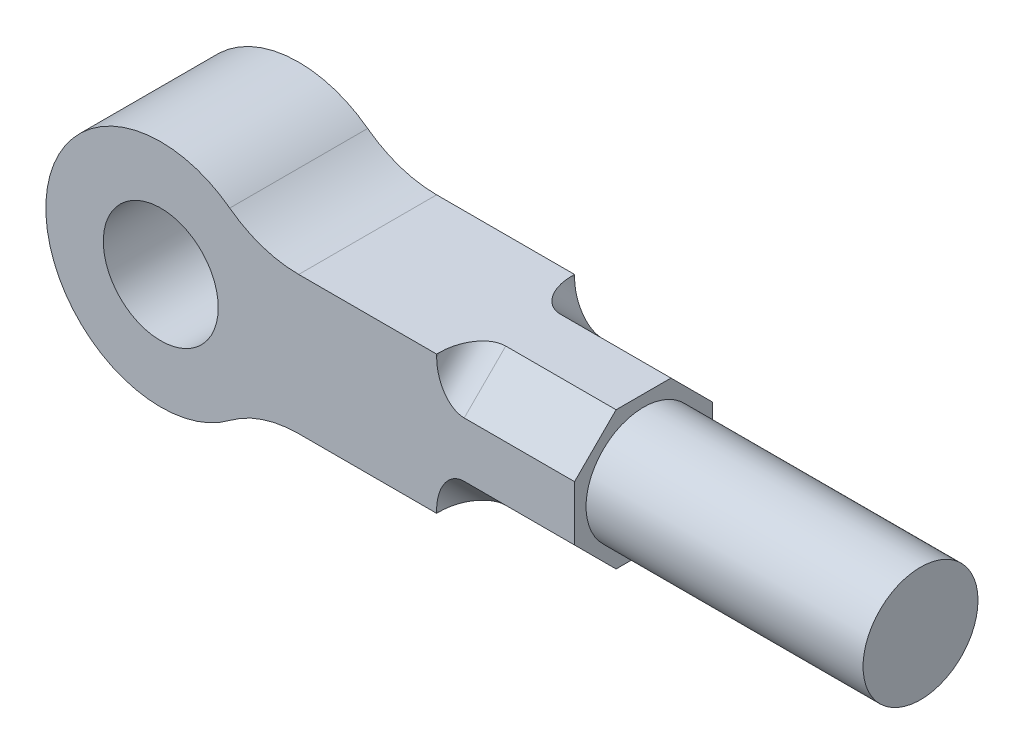
ISO-10303-21;
HEADER;
FILE_DESCRIPTION(('STEP AP214'),'2;1');
FILE_NAME('part.step','',(''),(''),'','','');
FILE_SCHEMA(('AUTOMOTIVE_DESIGN { 1 0 10303 214 1 1 1 1 }'));
ENDSEC;
DATA;
#1=APPLICATION_CONTEXT('core data for automotive mechanical design processes');
#2=APPLICATION_PROTOCOL_DEFINITION('international standard','automotive_design',2000,#1);
#3=PRODUCT_CONTEXT('',#1,'mechanical');
#4=PRODUCT('Part','Part','',(#3));
#5=PRODUCT_RELATED_PRODUCT_CATEGORY('part','',(#4));
#6=PRODUCT_DEFINITION_FORMATION('','',#4);
#7=PRODUCT_DEFINITION_CONTEXT('part definition',#1,'design');
#8=PRODUCT_DEFINITION('design','',#6,#7);
#9=PRODUCT_DEFINITION_SHAPE('','',#8);
#10=(LENGTH_UNIT() NAMED_UNIT(*) SI_UNIT(.MILLI.,.METRE.));
#11=(NAMED_UNIT(*) PLANE_ANGLE_UNIT() SI_UNIT($,.RADIAN.));
#12=(NAMED_UNIT(*) SI_UNIT($,.STERADIAN.) SOLID_ANGLE_UNIT());
#13=UNCERTAINTY_MEASURE_WITH_UNIT(LENGTH_MEASURE(1.E-05),#10,'distance_accuracy_value','');
#14=(GEOMETRIC_REPRESENTATION_CONTEXT(3) GLOBAL_UNCERTAINTY_ASSIGNED_CONTEXT((#13)) GLOBAL_UNIT_ASSIGNED_CONTEXT((#10,
#11,#12)) REPRESENTATION_CONTEXT('',''));
#15=CARTESIAN_POINT('',(0.,0.,0.));
#16=DIRECTION('',(0.,0.,1.));
#17=DIRECTION('',(1.,0.,0.));
#18=AXIS2_PLACEMENT_3D('',#15,#16,#17);
#19=CARTESIAN_POINT('',(0.,0.,60.));
#20=DIRECTION('',(0.,0.,1.));
#21=DIRECTION('',(1.,0.,0.));
#22=AXIS2_PLACEMENT_3D('',#19,#20,#21);
#23=PLANE('',#22);
#24=CARTESIAN_POINT('',(0.,0.,60.));
#25=DIRECTION('',(0.,0.,1.));
#26=DIRECTION('',(1.,0.,0.));
#27=AXIS2_PLACEMENT_3D('',#24,#25,#26);
#28=CIRCLE('',#27,25.);
#29=CARTESIAN_POINT('',(25.,0.,60.));
#30=VERTEX_POINT('',#29);
#31=EDGE_CURVE('E310',#30,#30,#28,.T.);
#32=ORIENTED_EDGE('',*,*,#31,.F.);
#33=EDGE_LOOP('',(#32));
#34=FACE_BOUND('',#33,.T.);
#35=DIRECTION('',(0.,1.,0.));
#36=VECTOR('',#35,1.);
#37=CARTESIAN_POINT('',(120.,-30.0000000000006,59.9999999999999));
#38=LINE('',#37,#36);
#39=CARTESIAN_POINT('',(120.,-30.0000000000006,59.9999999999999));
#40=VERTEX_POINT('',#39);
#41=CARTESIAN_POINT('',(120.,-28.9105627484778,59.9999999999999));
#42=VERTEX_POINT('',#41);
#43=EDGE_CURVE('E297',#40,#42,#38,.T.);
#44=ORIENTED_EDGE('',*,*,#43,.T.);
#45=CARTESIAN_POINT('',(132.,-28.9105627484776,60.));
#46=DIRECTION('',(0.,0.,1.));
#47=DIRECTION('',(0.,1.,0.));
#48=AXIS2_PLACEMENT_3D('',#45,#46,#47);
#49=ELLIPSE('',#48,16.9705627484773,12.);
#50=CARTESIAN_POINT('',(132.,-11.9400000000006,59.9999999999998));
#51=VERTEX_POINT('',#50);
#52=EDGE_CURVE('E252',#42,#51,#49,.F.);
#53=ORIENTED_EDGE('',*,*,#52,.T.);
#54=DIRECTION('',(1.,0.,0.));
#55=VECTOR('',#54,1.);
#56=CARTESIAN_POINT('',(120.,-11.9400000000006,59.9999999999998));
#57=LINE('',#56,#55);
#58=CARTESIAN_POINT('',(180.,-11.9400000000006,59.9999999999998));
#59=VERTEX_POINT('',#58);
#60=EDGE_CURVE('E290',#51,#59,#57,.T.);
#61=ORIENTED_EDGE('',*,*,#60,.T.);
#62=DIRECTION('',(0.,1.,0.));
#63=VECTOR('',#62,1.);
#64=CARTESIAN_POINT('',(180.,30.,60.));
#65=LINE('',#64,#63);
#66=CARTESIAN_POINT('',(180.,11.9399999999997,60.0000000000001));
#67=VERTEX_POINT('',#66);
#68=EDGE_CURVE('E207',#59,#67,#65,.T.);
#69=ORIENTED_EDGE('',*,*,#68,.T.);
#70=DIRECTION('',(1.,0.,0.));
#71=VECTOR('',#70,1.);
#72=CARTESIAN_POINT('',(120.,11.9399999999997,60.0000000000001));
#73=LINE('',#72,#71);
#74=CARTESIAN_POINT('',(132.,11.9399999999997,60.0000000000001));
#75=VERTEX_POINT('',#74);
#76=EDGE_CURVE('E305',#75,#67,#73,.T.);
#77=ORIENTED_EDGE('',*,*,#76,.F.);
#78=CARTESIAN_POINT('',(132.,28.9105627484768,60.));
#79=DIRECTION('',(0.,0.,1.));
#80=DIRECTION('',(0.,1.,0.));
#81=AXIS2_PLACEMENT_3D('',#78,#79,#80);
#82=ELLIPSE('',#81,16.970562748477,12.);
#83=CARTESIAN_POINT('',(120.,28.9105627484769,60.));
#84=VERTEX_POINT('',#83);
#85=EDGE_CURVE('E55',#75,#84,#82,.F.);
#86=ORIENTED_EDGE('',*,*,#85,.T.);
#87=DIRECTION('',(0.,1.,0.));
#88=VECTOR('',#87,1.);
#89=CARTESIAN_POINT('',(120.,11.9399999999997,60.0000000000001));
#90=LINE('',#89,#88);
#91=CARTESIAN_POINT('',(120.,29.9999999999997,59.9999999999999));
#92=VERTEX_POINT('',#91);
#93=EDGE_CURVE('E303',#84,#92,#90,.T.);
#94=ORIENTED_EDGE('',*,*,#93,.T.);
#95=DIRECTION('',(-1.,0.,0.));
#96=VECTOR('',#95,1.);
#97=CARTESIAN_POINT('',(40.,30.,60.));
#98=LINE('',#97,#96);
#99=CARTESIAN_POINT('',(60.,30.,60.));
#100=VERTEX_POINT('',#99);
#101=EDGE_CURVE('E202',#92,#100,#98,.T.);
#102=ORIENTED_EDGE('',*,*,#101,.T.);
#103=CARTESIAN_POINT('',(60.,80.,60.));
#104=DIRECTION('',(0.,0.,1.));
#105=DIRECTION('',(1.,0.,0.));
#106=AXIS2_PLACEMENT_3D('',#103,#104,#105);
#107=CIRCLE('',#106,50.);
#108=CARTESIAN_POINT('',(30.,40.,60.));
#109=VERTEX_POINT('',#108);
#110=EDGE_CURVE('E230',#100,#109,#107,.F.);
#111=ORIENTED_EDGE('',*,*,#110,.T.);
#112=CARTESIAN_POINT('',(0.,0.,60.));
#113=DIRECTION('',(0.,0.,1.));
#114=DIRECTION('',(1.,0.,0.));
#115=AXIS2_PLACEMENT_3D('',#112,#113,#114);
#116=CIRCLE('',#115,50.);
#117=CARTESIAN_POINT('',(30.,-40.,60.));
#118=VERTEX_POINT('',#117);
#119=EDGE_CURVE('E316',#109,#118,#116,.T.);
#120=ORIENTED_EDGE('',*,*,#119,.T.);
#121=CARTESIAN_POINT('',(60.,-80.,60.));
#122=DIRECTION('',(0.,0.,1.));
#123=DIRECTION('',(1.,0.,0.));
#124=AXIS2_PLACEMENT_3D('',#121,#122,#123);
#125=CIRCLE('',#124,50.);
#126=CARTESIAN_POINT('',(60.,-30.,60.));
#127=VERTEX_POINT('',#126);
#128=EDGE_CURVE('E225',#118,#127,#125,.F.);
#129=ORIENTED_EDGE('',*,*,#128,.T.);
#130=DIRECTION('',(1.,0.,0.));
#131=VECTOR('',#130,1.);
#132=CARTESIAN_POINT('',(40.,-30.,60.));
#133=LINE('',#132,#131);
#134=EDGE_CURVE('E319',#127,#40,#133,.T.);
#135=ORIENTED_EDGE('',*,*,#134,.T.);
#136=EDGE_LOOP('',(#44,#53,#61,#69,#77,#86,#94,#102,#111,#120,#129,#135));
#137=FACE_BOUND('',#136,.T.);
#138=ADVANCED_FACE('F47',(#34,#137),#23,.T.);
#139=CARTESIAN_POINT('',(0.,0.,0.));
#140=DIRECTION('',(0.,0.,1.));
#141=DIRECTION('',(1.,0.,0.));
#142=AXIS2_PLACEMENT_3D('',#139,#140,#141);
#143=PLANE('',#142);
#144=CARTESIAN_POINT('',(0.,0.,0.));
#145=DIRECTION('',(0.,0.,1.));
#146=DIRECTION('',(1.,0.,0.));
#147=AXIS2_PLACEMENT_3D('',#144,#145,#146);
#148=CIRCLE('',#147,25.);
#149=CARTESIAN_POINT('',(25.,0.,0.));
#150=VERTEX_POINT('',#149);
#151=EDGE_CURVE('E309',#150,#150,#148,.T.);
#152=ORIENTED_EDGE('',*,*,#151,.T.);
#153=EDGE_LOOP('',(#152));
#154=FACE_BOUND('',#153,.T.);
#155=DIRECTION('',(1.,0.,0.));
#156=VECTOR('',#155,1.);
#157=CARTESIAN_POINT('',(120.,-11.9400000000004,-5.3776427755281E-13));
#158=LINE('',#157,#156);
#159=CARTESIAN_POINT('',(132.,-11.9400000000004,-5.3776427755281E-13));
#160=VERTEX_POINT('',#159);
#161=CARTESIAN_POINT('',(180.,-11.9400000000004,0.));
#162=VERTEX_POINT('',#161);
#163=EDGE_CURVE('E281',#160,#162,#158,.T.);
#164=ORIENTED_EDGE('',*,*,#163,.F.);
#165=CARTESIAN_POINT('',(132.,-28.910562748478,0.));
#166=DIRECTION('',(0.,0.,1.));
#167=DIRECTION('',(0.,-1.,0.));
#168=AXIS2_PLACEMENT_3D('',#165,#166,#167);
#169=ELLIPSE('',#168,16.9705627484771,12.);
#170=CARTESIAN_POINT('',(120.,-28.9105627484775,-4.79081419877752E-13));
#171=VERTEX_POINT('',#170);
#172=EDGE_CURVE('E254',#160,#171,#169,.T.);
#173=ORIENTED_EDGE('',*,*,#172,.T.);
#174=DIRECTION('',(0.,-1.,0.));
#175=VECTOR('',#174,1.);
#176=CARTESIAN_POINT('',(120.,-11.9400000000004,-5.3776427755281E-13));
#177=LINE('',#176,#175);
#178=CARTESIAN_POINT('',(120.,-30.0000000000004,-4.75314232417645E-13));
#179=VERTEX_POINT('',#178);
#180=EDGE_CURVE('E284',#171,#179,#177,.T.);
#181=ORIENTED_EDGE('',*,*,#180,.T.);
#182=DIRECTION('',(1.,0.,0.));
#183=VECTOR('',#182,1.);
#184=CARTESIAN_POINT('',(40.,-30.,0.));
#185=LINE('',#184,#183);
#186=CARTESIAN_POINT('',(60.,-30.,0.));
#187=VERTEX_POINT('',#186);
#188=EDGE_CURVE('E326',#187,#179,#185,.T.);
#189=ORIENTED_EDGE('',*,*,#188,.F.);
#190=CARTESIAN_POINT('',(60.,-80.,0.));
#191=DIRECTION('',(0.,0.,1.));
#192=DIRECTION('',(1.,0.,0.));
#193=AXIS2_PLACEMENT_3D('',#190,#191,#192);
#194=CIRCLE('',#193,50.);
#195=CARTESIAN_POINT('',(30.,-40.,0.));
#196=VERTEX_POINT('',#195);
#197=EDGE_CURVE('E223',#187,#196,#194,.T.);
#198=ORIENTED_EDGE('',*,*,#197,.T.);
#199=CARTESIAN_POINT('',(0.,0.,0.));
#200=DIRECTION('',(0.,0.,1.));
#201=DIRECTION('',(1.,0.,0.));
#202=AXIS2_PLACEMENT_3D('',#199,#200,#201);
#203=CIRCLE('',#202,50.);
#204=CARTESIAN_POINT('',(30.,40.,0.));
#205=VERTEX_POINT('',#204);
#206=EDGE_CURVE('E313',#205,#196,#203,.T.);
#207=ORIENTED_EDGE('',*,*,#206,.F.);
#208=CARTESIAN_POINT('',(60.,80.,0.));
#209=DIRECTION('',(0.,0.,1.));
#210=DIRECTION('',(1.,0.,0.));
#211=AXIS2_PLACEMENT_3D('',#208,#209,#210);
#212=CIRCLE('',#211,50.);
#213=CARTESIAN_POINT('',(60.,30.,0.));
#214=VERTEX_POINT('',#213);
#215=EDGE_CURVE('E227',#205,#214,#212,.T.);
#216=ORIENTED_EDGE('',*,*,#215,.T.);
#217=DIRECTION('',(-1.,0.,0.));
#218=VECTOR('',#217,1.);
#219=CARTESIAN_POINT('',(40.,30.,0.));
#220=LINE('',#219,#218);
#221=CARTESIAN_POINT('',(120.,30.,0.));
#222=VERTEX_POINT('',#221);
#223=EDGE_CURVE('E210',#222,#214,#220,.T.);
#224=ORIENTED_EDGE('',*,*,#223,.F.);
#225=DIRECTION('',(0.,-1.,0.));
#226=VECTOR('',#225,1.);
#227=CARTESIAN_POINT('',(120.,30.,0.));
#228=LINE('',#227,#226);
#229=CARTESIAN_POINT('',(120.,28.9105627484771,0.));
#230=VERTEX_POINT('',#229);
#231=EDGE_CURVE('E182',#222,#230,#228,.T.);
#232=ORIENTED_EDGE('',*,*,#231,.T.);
#233=CARTESIAN_POINT('',(132.,28.9105627484771,0.));
#234=DIRECTION('',(0.,0.,1.));
#235=DIRECTION('',(0.,1.,0.));
#236=AXIS2_PLACEMENT_3D('',#233,#234,#235);
#237=ELLIPSE('',#236,16.9705627484771,12.);
#238=CARTESIAN_POINT('',(132.,11.94,0.));
#239=VERTEX_POINT('',#238);
#240=EDGE_CURVE('E260',#230,#239,#237,.T.);
#241=ORIENTED_EDGE('',*,*,#240,.T.);
#242=DIRECTION('',(1.,0.,0.));
#243=VECTOR('',#242,1.);
#244=CARTESIAN_POINT('',(120.,11.94,0.));
#245=LINE('',#244,#243);
#246=CARTESIAN_POINT('',(180.,11.94,0.));
#247=VERTEX_POINT('',#246);
#248=EDGE_CURVE('E183',#239,#247,#245,.T.);
#249=ORIENTED_EDGE('',*,*,#248,.T.);
#250=DIRECTION('',(0.,1.,0.));
#251=VECTOR('',#250,1.);
#252=CARTESIAN_POINT('',(180.,30.,0.));
#253=LINE('',#252,#251);
#254=EDGE_CURVE('E193',#162,#247,#253,.T.);
#255=ORIENTED_EDGE('',*,*,#254,.F.);
#256=EDGE_LOOP('',(#164,#173,#181,#189,#198,#207,#216,#224,#232,#241,#249,#255));
#257=FACE_BOUND('',#256,.T.);
#258=ADVANCED_FACE('F265',(#154,#257),#143,.F.);
#259=CARTESIAN_POINT('',(40.,-30.,60.));
#260=DIRECTION('',(0.,1.,0.));
#261=DIRECTION('',(0.,0.,1.));
#262=AXIS2_PLACEMENT_3D('',#259,#260,#261);
#263=PLANE('',#262);
#264=DIRECTION('',(1.,0.,0.));
#265=VECTOR('',#264,1.);
#266=CARTESIAN_POINT('',(120.,-30.0000000000008,41.9399999999999));
#267=LINE('',#266,#265);
#268=CARTESIAN_POINT('',(132.,-30.0000000000008,41.9399999999999));
#269=VERTEX_POINT('',#268);
#270=CARTESIAN_POINT('',(180.,-30.,41.9399999999999));
#271=VERTEX_POINT('',#270);
#272=EDGE_CURVE('E292',#269,#271,#267,.T.);
#273=ORIENTED_EDGE('',*,*,#272,.F.);
#274=CARTESIAN_POINT('',(132.,-30.,58.9105627484777));
#275=DIRECTION('',(0.,1.,0.));
#276=DIRECTION('',(0.,0.,1.));
#277=AXIS2_PLACEMENT_3D('',#274,#275,#276);
#278=ELLIPSE('',#277,16.970562748477,12.);
#279=CARTESIAN_POINT('',(120.,-30.0000000000006,58.910562748477));
#280=VERTEX_POINT('',#279);
#281=EDGE_CURVE('E250',#269,#280,#278,.T.);
#282=ORIENTED_EDGE('',*,*,#281,.T.);
#283=DIRECTION('',(0.,0.,1.));
#284=VECTOR('',#283,1.);
#285=CARTESIAN_POINT('',(120.,-30.0000000000008,41.9399999999999));
#286=LINE('',#285,#284);
#287=EDGE_CURVE('E295',#280,#40,#286,.T.);
#288=ORIENTED_EDGE('',*,*,#287,.T.);
#289=ORIENTED_EDGE('',*,*,#134,.F.);
#290=DIRECTION('',(0.,0.,1.));
#291=VECTOR('',#290,1.);
#292=CARTESIAN_POINT('',(60.,-30.,0.));
#293=LINE('',#292,#291);
#294=EDGE_CURVE('E205',#127,#187,#293,.F.);
#295=ORIENTED_EDGE('',*,*,#294,.T.);
#296=ORIENTED_EDGE('',*,*,#188,.T.);
#297=DIRECTION('',(0.,0.,1.));
#298=VECTOR('',#297,1.);
#299=CARTESIAN_POINT('',(120.,-30.0000000000004,-4.75314232417645E-13));
#300=LINE('',#299,#298);
#301=CARTESIAN_POINT('',(120.,-30.0000000000004,1.08943725152238));
#302=VERTEX_POINT('',#301);
#303=EDGE_CURVE('E286',#179,#302,#300,.T.);
#304=ORIENTED_EDGE('',*,*,#303,.T.);
#305=CARTESIAN_POINT('',(132.,-30.,1.08943725152203));
#306=DIRECTION('',(0.,1.,0.));
#307=DIRECTION('',(0.,0.,1.));
#308=AXIS2_PLACEMENT_3D('',#305,#306,#307);
#309=ELLIPSE('',#308,16.9705627484772,12.);
#310=CARTESIAN_POINT('',(132.,-30.0000000000003,18.0599999999995));
#311=VERTEX_POINT('',#310);
#312=EDGE_CURVE('E256',#302,#311,#309,.T.);
#313=ORIENTED_EDGE('',*,*,#312,.T.);
#314=DIRECTION('',(1.,0.,0.));
#315=VECTOR('',#314,1.);
#316=CARTESIAN_POINT('',(120.,-30.0000000000003,18.0599999999995));
#317=LINE('',#316,#315);
#318=CARTESIAN_POINT('',(180.,-30.0000000000003,18.0599999999995));
#319=VERTEX_POINT('',#318);
#320=EDGE_CURVE('E279',#311,#319,#317,.T.);
#321=ORIENTED_EDGE('',*,*,#320,.T.);
#322=DIRECTION('',(0.,0.,-1.));
#323=VECTOR('',#322,1.);
#324=CARTESIAN_POINT('',(180.,-30.,60.));
#325=LINE('',#324,#323);
#326=EDGE_CURVE('E201',#271,#319,#325,.T.);
#327=ORIENTED_EDGE('',*,*,#326,.F.);
#328=EDGE_LOOP('',(#273,#282,#288,#289,#295,#296,#304,#313,#321,#327));
#329=FACE_BOUND('',#328,.T.);
#330=ADVANCED_FACE('F346',(#329),#263,.F.);
#331=CARTESIAN_POINT('',(180.,30.,60.));
#332=DIRECTION('',(-1.,0.,0.));
#333=DIRECTION('',(0.,0.,1.));
#334=AXIS2_PLACEMENT_3D('',#331,#332,#333);
#335=PLANE('',#334);
#336=CARTESIAN_POINT('',(180.,0.,30.));
#337=DIRECTION('',(1.,0.,0.));
#338=DIRECTION('',(0.,0.,-1.));
#339=AXIS2_PLACEMENT_3D('',#336,#337,#338);
#340=CIRCLE('',#339,25.);
#341=CARTESIAN_POINT('',(180.,0.,5.));
#342=VERTEX_POINT('',#341);
#343=EDGE_CURVE('E232',#342,#342,#340,.T.);
#344=ORIENTED_EDGE('',*,*,#343,.F.);
#345=EDGE_LOOP('',(#344));
#346=FACE_BOUND('',#345,.T.);
#347=DIRECTION('',(0.,-0.707106781186552,-0.707106781186543));
#348=VECTOR('',#347,1.);
#349=CARTESIAN_POINT('',(180.,-11.9400000000006,59.9999999999998));
#350=LINE('',#349,#348);
#351=EDGE_CURVE('E282',#59,#271,#350,.T.);
#352=ORIENTED_EDGE('',*,*,#351,.T.);
#353=ORIENTED_EDGE('',*,*,#326,.T.);
#354=DIRECTION('',(0.,0.707106781186545,-0.70710678118655));
#355=VECTOR('',#354,1.);
#356=CARTESIAN_POINT('',(180.,-30.0000000000003,18.0599999999995));
#357=LINE('',#356,#355);
#358=EDGE_CURVE('E270',#319,#162,#357,.T.);
#359=ORIENTED_EDGE('',*,*,#358,.T.);
#360=ORIENTED_EDGE('',*,*,#254,.T.);
#361=DIRECTION('',(0.,0.707106781186547,0.707106781186547));
#362=VECTOR('',#361,1.);
#363=CARTESIAN_POINT('',(180.,11.94,0.));
#364=LINE('',#363,#362);
#365=CARTESIAN_POINT('',(180.,30.,18.06));
#366=VERTEX_POINT('',#365);
#367=EDGE_CURVE('E176',#247,#366,#364,.T.);
#368=ORIENTED_EDGE('',*,*,#367,.T.);
#369=DIRECTION('',(0.,0.,-1.));
#370=VECTOR('',#369,1.);
#371=CARTESIAN_POINT('',(180.,30.,60.));
#372=LINE('',#371,#370);
#373=CARTESIAN_POINT('',(180.,29.9999999999995,41.9399999999999));
#374=VERTEX_POINT('',#373);
#375=EDGE_CURVE('E190',#374,#366,#372,.T.);
#376=ORIENTED_EDGE('',*,*,#375,.F.);
#377=DIRECTION('',(0.,-0.70710678118654,0.707106781186555));
#378=VECTOR('',#377,1.);
#379=CARTESIAN_POINT('',(180.,29.9999999999995,41.9399999999999));
#380=LINE('',#379,#378);
#381=EDGE_CURVE('E194',#374,#67,#380,.T.);
#382=ORIENTED_EDGE('',*,*,#381,.T.);
#383=ORIENTED_EDGE('',*,*,#68,.F.);
#384=EDGE_LOOP('',(#352,#353,#359,#360,#368,#376,#382,#383));
#385=FACE_BOUND('',#384,.T.);
#386=ADVANCED_FACE('F188',(#346,#385),#335,.F.);
#387=CARTESIAN_POINT('',(40.,30.,60.));
#388=DIRECTION('',(0.,-1.,0.));
#389=DIRECTION('',(0.,0.,-1.));
#390=AXIS2_PLACEMENT_3D('',#387,#388,#389);
#391=PLANE('',#390);
#392=DIRECTION('',(1.,0.,0.));
#393=VECTOR('',#392,1.);
#394=CARTESIAN_POINT('',(120.,30.,18.06));
#395=LINE('',#394,#393);
#396=CARTESIAN_POINT('',(132.,30.,18.06));
#397=VERTEX_POINT('',#396);
#398=EDGE_CURVE('E172',#397,#366,#395,.T.);
#399=ORIENTED_EDGE('',*,*,#398,.F.);
#400=CARTESIAN_POINT('',(132.,30.,1.08943725152286));
#401=DIRECTION('',(0.,-1.,0.));
#402=DIRECTION('',(0.,0.,1.));
#403=AXIS2_PLACEMENT_3D('',#400,#401,#402);
#404=ELLIPSE('',#403,16.9705627484771,12.);
#405=CARTESIAN_POINT('',(120.,30.,1.08943725152286));
#406=VERTEX_POINT('',#405);
#407=EDGE_CURVE('E258',#397,#406,#404,.T.);
#408=ORIENTED_EDGE('',*,*,#407,.T.);
#409=DIRECTION('',(0.,0.,-1.));
#410=VECTOR('',#409,1.);
#411=CARTESIAN_POINT('',(120.,30.,18.06));
#412=LINE('',#411,#410);
#413=EDGE_CURVE('E195',#406,#222,#412,.T.);
#414=ORIENTED_EDGE('',*,*,#413,.T.);
#415=ORIENTED_EDGE('',*,*,#223,.T.);
#416=DIRECTION('',(0.,0.,1.));
#417=VECTOR('',#416,1.);
#418=CARTESIAN_POINT('',(60.,30.,60.));
#419=LINE('',#418,#417);
#420=EDGE_CURVE('E220',#214,#100,#419,.T.);
#421=ORIENTED_EDGE('',*,*,#420,.T.);
#422=ORIENTED_EDGE('',*,*,#101,.F.);
#423=DIRECTION('',(0.,0.,-1.));
#424=VECTOR('',#423,1.);
#425=CARTESIAN_POINT('',(120.,29.9999999999997,59.9999999999999));
#426=LINE('',#425,#424);
#427=CARTESIAN_POINT('',(120.,29.9999999999997,58.9105627484771));
#428=VERTEX_POINT('',#427);
#429=EDGE_CURVE('E301',#92,#428,#426,.T.);
#430=ORIENTED_EDGE('',*,*,#429,.T.);
#431=CARTESIAN_POINT('',(132.,30.,58.9105627484768));
#432=DIRECTION('',(0.,-1.,0.));
#433=DIRECTION('',(0.,0.,-1.));
#434=AXIS2_PLACEMENT_3D('',#431,#432,#433);
#435=ELLIPSE('',#434,16.9705627484773,12.);
#436=CARTESIAN_POINT('',(132.,29.9999999999995,41.9399999999999));
#437=VERTEX_POINT('',#436);
#438=EDGE_CURVE('E11',#428,#437,#435,.T.);
#439=ORIENTED_EDGE('',*,*,#438,.T.);
#440=DIRECTION('',(1.,0.,0.));
#441=VECTOR('',#440,1.);
#442=CARTESIAN_POINT('',(120.,29.9999999999995,41.9399999999999));
#443=LINE('',#442,#441);
#444=EDGE_CURVE('E199',#437,#374,#443,.T.);
#445=ORIENTED_EDGE('',*,*,#444,.T.);
#446=ORIENTED_EDGE('',*,*,#375,.T.);
#447=EDGE_LOOP('',(#399,#408,#414,#415,#421,#422,#430,#439,#445,#446));
#448=FACE_BOUND('',#447,.T.);
#449=ADVANCED_FACE('F197',(#448),#391,.F.);
#450=CARTESIAN_POINT('',(0.,0.,60.));
#451=DIRECTION('',(0.,0.,-1.));
#452=DIRECTION('',(-1.,0.,0.));
#453=AXIS2_PLACEMENT_3D('',#450,#451,#452);
#454=CYLINDRICAL_SURFACE('',#453,50.);
#455=ORIENTED_EDGE('',*,*,#206,.T.);
#456=DIRECTION('',(0.,0.,-1.));
#457=VECTOR('',#456,1.);
#458=CARTESIAN_POINT('',(30.,-40.,60.));
#459=LINE('',#458,#457);
#460=EDGE_CURVE('E218',#196,#118,#459,.F.);
#461=ORIENTED_EDGE('',*,*,#460,.T.);
#462=ORIENTED_EDGE('',*,*,#119,.F.);
#463=DIRECTION('',(0.,0.,-1.));
#464=VECTOR('',#463,1.);
#465=CARTESIAN_POINT('',(30.,40.,60.));
#466=LINE('',#465,#464);
#467=EDGE_CURVE('E215',#109,#205,#466,.T.);
#468=ORIENTED_EDGE('',*,*,#467,.T.);
#469=EDGE_LOOP('',(#455,#461,#462,#468));
#470=FACE_BOUND('',#469,.T.);
#471=ADVANCED_FACE('F338',(#470),#454,.T.);
#472=CARTESIAN_POINT('',(0.,0.,60.));
#473=DIRECTION('',(0.,0.,-1.));
#474=DIRECTION('',(-1.,0.,0.));
#475=AXIS2_PLACEMENT_3D('',#472,#473,#474);
#476=CYLINDRICAL_SURFACE('',#475,25.);
#477=ORIENTED_EDGE('',*,*,#31,.T.);
#478=EDGE_LOOP('',(#477));
#479=FACE_BOUND('',#478,.T.);
#480=ORIENTED_EDGE('',*,*,#151,.F.);
#481=EDGE_LOOP('',(#480));
#482=FACE_BOUND('',#481,.T.);
#483=ADVANCED_FACE('F390',(#479,#482),#476,.F.);
#484=CARTESIAN_POINT('',(60.,-80.,60.));
#485=DIRECTION('',(0.,0.,-1.));
#486=DIRECTION('',(-1.,0.,0.));
#487=AXIS2_PLACEMENT_3D('',#484,#485,#486);
#488=CYLINDRICAL_SURFACE('',#487,50.);
#489=ORIENTED_EDGE('',*,*,#128,.F.);
#490=ORIENTED_EDGE('',*,*,#460,.F.);
#491=ORIENTED_EDGE('',*,*,#197,.F.);
#492=ORIENTED_EDGE('',*,*,#294,.F.);
#493=EDGE_LOOP('',(#489,#490,#491,#492));
#494=FACE_BOUND('',#493,.T.);
#495=ADVANCED_FACE('F341',(#494),#488,.F.);
#496=CARTESIAN_POINT('',(60.,80.,60.));
#497=DIRECTION('',(0.,0.,-1.));
#498=DIRECTION('',(-1.,0.,0.));
#499=AXIS2_PLACEMENT_3D('',#496,#497,#498);
#500=CYLINDRICAL_SURFACE('',#499,50.);
#501=ORIENTED_EDGE('',*,*,#110,.F.);
#502=ORIENTED_EDGE('',*,*,#420,.F.);
#503=ORIENTED_EDGE('',*,*,#215,.F.);
#504=ORIENTED_EDGE('',*,*,#467,.F.);
#505=EDGE_LOOP('',(#501,#502,#503,#504));
#506=FACE_BOUND('',#505,.T.);
#507=ADVANCED_FACE('F334',(#506),#500,.F.);
#508=CARTESIAN_POINT('',(120.,29.9999999999995,41.9399999999999));
#509=DIRECTION('',(0.,0.707106781186555,0.70710678118654));
#510=DIRECTION('',(0.,-0.70710678118654,0.707106781186555));
#511=AXIS2_PLACEMENT_3D('',#508,#509,#510);
#512=PLANE('',#511);
#513=ORIENTED_EDGE('',*,*,#444,.F.);
#514=DIRECTION('',(0.,-0.70710678118654,0.707106781186555));
#515=VECTOR('',#514,1.);
#516=CARTESIAN_POINT('',(132.,11.9399999999997,60.0000000000001));
#517=LINE('',#516,#515);
#518=EDGE_CURVE('E246',#437,#75,#517,.T.);
#519=ORIENTED_EDGE('',*,*,#518,.T.);
#520=ORIENTED_EDGE('',*,*,#76,.T.);
#521=ORIENTED_EDGE('',*,*,#381,.F.);
#522=EDGE_LOOP('',(#513,#519,#520,#521));
#523=FACE_BOUND('',#522,.T.);
#524=ADVANCED_FACE('F366',(#523),#512,.T.);
#525=CARTESIAN_POINT('',(120.,0.,0.));
#526=DIRECTION('',(1.,0.,0.));
#527=DIRECTION('',(0.,0.,-1.));
#528=AXIS2_PLACEMENT_3D('',#525,#526,#527);
#529=PLANE('',#528);
#530=ORIENTED_EDGE('',*,*,#93,.F.);
#531=DIRECTION('',(0.,-0.70710678118654,0.707106781186555));
#532=VECTOR('',#531,1.);
#533=CARTESIAN_POINT('',(120.,38.4852813742384,50.4252813742382));
#534=LINE('',#533,#532);
#535=EDGE_CURVE('E68',#84,#428,#534,.F.);
#536=ORIENTED_EDGE('',*,*,#535,.T.);
#537=ORIENTED_EDGE('',*,*,#429,.F.);
#538=EDGE_LOOP('',(#530,#536,#537));
#539=FACE_BOUND('',#538,.T.);
#540=ADVANCED_FACE('F370',(#539),#529,.T.);
#541=CARTESIAN_POINT('',(120.,11.94,0.));
#542=DIRECTION('',(0.,0.707106781186547,-0.707106781186547));
#543=DIRECTION('',(0.,0.707106781186548,0.707106781186548));
#544=AXIS2_PLACEMENT_3D('',#541,#542,#543);
#545=PLANE('',#544);
#546=ORIENTED_EDGE('',*,*,#248,.F.);
#547=DIRECTION('',(0.,0.707106781186548,0.707106781186548));
#548=VECTOR('',#547,1.);
#549=CARTESIAN_POINT('',(132.,11.94,0.));
#550=LINE('',#549,#548);
#551=EDGE_CURVE('E179',#239,#397,#550,.T.);
#552=ORIENTED_EDGE('',*,*,#551,.T.);
#553=ORIENTED_EDGE('',*,*,#398,.T.);
#554=ORIENTED_EDGE('',*,*,#367,.F.);
#555=EDGE_LOOP('',(#546,#552,#553,#554));
#556=FACE_BOUND('',#555,.T.);
#557=ADVANCED_FACE('F175',(#556),#545,.T.);
#558=CARTESIAN_POINT('',(120.,0.,0.));
#559=DIRECTION('',(-1.,0.,0.));
#560=DIRECTION('',(0.,0.,1.));
#561=AXIS2_PLACEMENT_3D('',#558,#559,#560);
#562=PLANE('',#561);
#563=ORIENTED_EDGE('',*,*,#413,.F.);
#564=DIRECTION('',(0.,0.707106781186548,0.707106781186548));
#565=VECTOR('',#564,1.);
#566=CARTESIAN_POINT('',(120.,14.4552813742386,-14.4552813742386));
#567=LINE('',#566,#565);
#568=EDGE_CURVE('E244',#406,#230,#567,.F.);
#569=ORIENTED_EDGE('',*,*,#568,.T.);
#570=ORIENTED_EDGE('',*,*,#231,.F.);
#571=EDGE_LOOP('',(#563,#569,#570));
#572=FACE_BOUND('',#571,.T.);
#573=ADVANCED_FACE('F275',(#572),#562,.F.);
#574=CARTESIAN_POINT('',(120.,-30.0000000000003,18.0599999999995));
#575=DIRECTION('',(0.,-0.70710678118655,-0.707106781186545));
#576=DIRECTION('',(0.,0.707106781186545,-0.70710678118655));
#577=AXIS2_PLACEMENT_3D('',#574,#575,#576);
#578=PLANE('',#577);
#579=ORIENTED_EDGE('',*,*,#320,.F.);
#580=DIRECTION('',(0.,0.707106781186545,-0.70710678118655));
#581=VECTOR('',#580,1.);
#582=CARTESIAN_POINT('',(132.,-11.9400000000004,-5.392885437807E-13));
#583=LINE('',#582,#581);
#584=EDGE_CURVE('E238',#311,#160,#583,.T.);
#585=ORIENTED_EDGE('',*,*,#584,.T.);
#586=ORIENTED_EDGE('',*,*,#163,.T.);
#587=ORIENTED_EDGE('',*,*,#358,.F.);
#588=EDGE_LOOP('',(#579,#585,#586,#587));
#589=FACE_BOUND('',#588,.T.);
#590=ADVANCED_FACE('F479',(#589),#578,.T.);
#591=CARTESIAN_POINT('',(120.,0.,0.));
#592=DIRECTION('',(1.,0.,0.));
#593=DIRECTION('',(0.,0.,-1.));
#594=AXIS2_PLACEMENT_3D('',#591,#592,#593);
#595=PLANE('',#594);
#596=ORIENTED_EDGE('',*,*,#180,.F.);
#597=DIRECTION('',(0.,0.707106781186545,-0.70710678118655));
#598=VECTOR('',#597,1.);
#599=CARTESIAN_POINT('',(120.,-38.4852813742389,9.57471862576098));
#600=LINE('',#599,#598);
#601=EDGE_CURVE('E241',#171,#302,#600,.F.);
#602=ORIENTED_EDGE('',*,*,#601,.T.);
#603=ORIENTED_EDGE('',*,*,#303,.F.);
#604=EDGE_LOOP('',(#596,#602,#603));
#605=FACE_BOUND('',#604,.T.);
#606=ADVANCED_FACE('F470',(#605),#595,.T.);
#607=CARTESIAN_POINT('',(120.,-11.9400000000006,59.9999999999998));
#608=DIRECTION('',(0.,-0.707106781186543,0.707106781186552));
#609=DIRECTION('',(0.,-0.707106781186552,-0.707106781186543));
#610=AXIS2_PLACEMENT_3D('',#607,#608,#609);
#611=PLANE('',#610);
#612=ORIENTED_EDGE('',*,*,#60,.F.);
#613=DIRECTION('',(0.,-0.707106781186552,-0.707106781186543));
#614=VECTOR('',#613,1.);
#615=CARTESIAN_POINT('',(132.,-30.0000000000008,41.9399999999999));
#616=LINE('',#615,#614);
#617=EDGE_CURVE('E233',#51,#269,#616,.T.);
#618=ORIENTED_EDGE('',*,*,#617,.T.);
#619=ORIENTED_EDGE('',*,*,#272,.T.);
#620=ORIENTED_EDGE('',*,*,#351,.F.);
#621=EDGE_LOOP('',(#612,#618,#619,#620));
#622=FACE_BOUND('',#621,.T.);
#623=ADVANCED_FACE('F359',(#622),#611,.T.);
#624=CARTESIAN_POINT('',(120.,0.,0.));
#625=DIRECTION('',(1.,0.,0.));
#626=DIRECTION('',(0.,0.,-1.));
#627=AXIS2_PLACEMENT_3D('',#624,#625,#626);
#628=PLANE('',#627);
#629=ORIENTED_EDGE('',*,*,#287,.F.);
#630=DIRECTION('',(0.,-0.707106781186552,-0.707106781186543));
#631=VECTOR('',#630,1.);
#632=CARTESIAN_POINT('',(120.,-20.4252813742391,68.4852813742384));
#633=LINE('',#632,#631);
#634=EDGE_CURVE('E236',#280,#42,#633,.F.);
#635=ORIENTED_EDGE('',*,*,#634,.T.);
#636=ORIENTED_EDGE('',*,*,#43,.F.);
#637=EDGE_LOOP('',(#629,#635,#636));
#638=FACE_BOUND('',#637,.T.);
#639=ADVANCED_FACE('F352',(#638),#628,.T.);
#640=CARTESIAN_POINT('',(300.5,0.,30.));
#641=DIRECTION('',(-1.,0.,0.));
#642=DIRECTION('',(0.,0.,1.));
#643=AXIS2_PLACEMENT_3D('',#640,#641,#642);
#644=CYLINDRICAL_SURFACE('',#643,25.);
#645=CARTESIAN_POINT('',(300.5,0.,30.));
#646=DIRECTION('',(1.,0.,0.));
#647=DIRECTION('',(0.,0.,-1.));
#648=AXIS2_PLACEMENT_3D('',#645,#646,#647);
#649=CIRCLE('',#648,25.);
#650=CARTESIAN_POINT('',(300.5,0.,5.));
#651=VERTEX_POINT('',#650);
#652=EDGE_CURVE('E293',#651,#651,#649,.T.);
#653=ORIENTED_EDGE('',*,*,#652,.F.);
#654=EDGE_LOOP('',(#653));
#655=FACE_BOUND('',#654,.T.);
#656=ORIENTED_EDGE('',*,*,#343,.T.);
#657=EDGE_LOOP('',(#656));
#658=FACE_BOUND('',#657,.T.);
#659=ADVANCED_FACE('F443',(#655,#658),#644,.T.);
#660=CARTESIAN_POINT('',(300.5,0.,0.));
#661=DIRECTION('',(1.,0.,0.));
#662=DIRECTION('',(0.,0.,-1.));
#663=AXIS2_PLACEMENT_3D('',#660,#661,#662);
#664=PLANE('',#663);
#665=ORIENTED_EDGE('',*,*,#652,.T.);
#666=EDGE_LOOP('',(#665));
#667=FACE_BOUND('',#666,.T.);
#668=ADVANCED_FACE('F408',(#667),#664,.T.);
#669=CARTESIAN_POINT('',(132.,-20.4252813742391,68.4852813742384));
#670=DIRECTION('',(0.,0.707106781186552,0.707106781186543));
#671=DIRECTION('',(0.,-0.707106781186543,0.707106781186552));
#672=AXIS2_PLACEMENT_3D('',#669,#670,#671);
#673=CYLINDRICAL_SURFACE('',#672,12.);
#674=ORIENTED_EDGE('',*,*,#52,.F.);
#675=ORIENTED_EDGE('',*,*,#634,.F.);
#676=ORIENTED_EDGE('',*,*,#281,.F.);
#677=ORIENTED_EDGE('',*,*,#617,.F.);
#678=EDGE_LOOP('',(#674,#675,#676,#677));
#679=FACE_BOUND('',#678,.T.);
#680=ADVANCED_FACE('F357',(#679),#673,.F.);
#681=CARTESIAN_POINT('',(132.,-38.4852813742389,9.57471862576098));
#682=DIRECTION('',(0.,-0.707106781186545,0.70710678118655));
#683=DIRECTION('',(0.,-0.70710678118655,-0.707106781186545));
#684=AXIS2_PLACEMENT_3D('',#681,#682,#683);
#685=CYLINDRICAL_SURFACE('',#684,12.);
#686=ORIENTED_EDGE('',*,*,#312,.F.);
#687=ORIENTED_EDGE('',*,*,#601,.F.);
#688=ORIENTED_EDGE('',*,*,#172,.F.);
#689=ORIENTED_EDGE('',*,*,#584,.F.);
#690=EDGE_LOOP('',(#686,#687,#688,#689));
#691=FACE_BOUND('',#690,.T.);
#692=ADVANCED_FACE('F407',(#691),#685,.F.);
#693=CARTESIAN_POINT('',(132.,20.4252813742386,-8.48528137423857));
#694=DIRECTION('',(0.,0.707106781186548,0.707106781186548));
#695=DIRECTION('',(0.,-0.707106781186548,0.707106781186548));
#696=AXIS2_PLACEMENT_3D('',#693,#694,#695);
#697=CYLINDRICAL_SURFACE('',#696,12.);
#698=ORIENTED_EDGE('',*,*,#240,.F.);
#699=ORIENTED_EDGE('',*,*,#568,.F.);
#700=ORIENTED_EDGE('',*,*,#407,.F.);
#701=ORIENTED_EDGE('',*,*,#551,.F.);
#702=EDGE_LOOP('',(#698,#699,#700,#701));
#703=FACE_BOUND('',#702,.T.);
#704=ADVANCED_FACE('F272',(#703),#697,.F.);
#705=CARTESIAN_POINT('',(132.,38.4852813742382,50.4252813742384));
#706=DIRECTION('',(0.,0.70710678118654,-0.707106781186555));
#707=DIRECTION('',(0.,0.707106781186555,0.70710678118654));
#708=AXIS2_PLACEMENT_3D('',#705,#706,#707);
#709=CYLINDRICAL_SURFACE('',#708,12.);
#710=ORIENTED_EDGE('',*,*,#438,.F.);
#711=ORIENTED_EDGE('',*,*,#535,.F.);
#712=ORIENTED_EDGE('',*,*,#85,.F.);
#713=ORIENTED_EDGE('',*,*,#518,.F.);
#714=EDGE_LOOP('',(#710,#711,#712,#713));
#715=FACE_BOUND('',#714,.T.);
#716=ADVANCED_FACE('F49',(#715),#709,.F.);
#717=CLOSED_SHELL('',(#138,#258,#330,#386,#449,#471,#483,#495,#507,#524,#540,#557,#573,#590,
#606,#623,#639,#659,#668,#680,#692,#704,#716));
#718=MANIFOLD_SOLID_BREP('B2',#717);
#719=ADVANCED_BREP_SHAPE_REPRESENTATION('',(#18,#718),#14);
#720=SHAPE_DEFINITION_REPRESENTATION(#9,#719);
ENDSEC;
END-ISO-10303-21;
